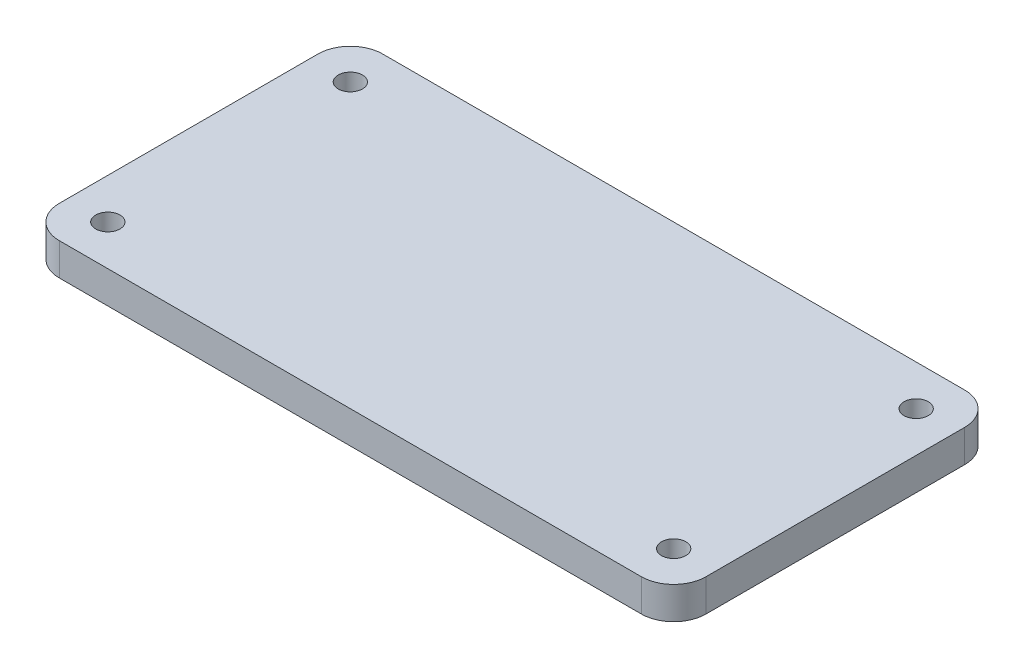
ISO-10303-21;
HEADER;
FILE_DESCRIPTION(('STEP AP214'),'2;1');
FILE_NAME('part.step','',(''),(''),'','','');
FILE_SCHEMA(('AUTOMOTIVE_DESIGN { 1 0 10303 214 1 1 1 1 }'));
ENDSEC;
DATA;
#1=APPLICATION_CONTEXT('core data for automotive mechanical design processes');
#2=APPLICATION_PROTOCOL_DEFINITION('international standard','automotive_design',2000,#1);
#3=PRODUCT_CONTEXT('',#1,'mechanical');
#4=PRODUCT('Part','Part','',(#3));
#5=PRODUCT_RELATED_PRODUCT_CATEGORY('part','',(#4));
#6=PRODUCT_DEFINITION_FORMATION('','',#4);
#7=PRODUCT_DEFINITION_CONTEXT('part definition',#1,'design');
#8=PRODUCT_DEFINITION('design','',#6,#7);
#9=PRODUCT_DEFINITION_SHAPE('','',#8);
#10=(LENGTH_UNIT() NAMED_UNIT(*) SI_UNIT(.MILLI.,.METRE.));
#11=(NAMED_UNIT(*) PLANE_ANGLE_UNIT() SI_UNIT($,.RADIAN.));
#12=(NAMED_UNIT(*) SI_UNIT($,.STERADIAN.) SOLID_ANGLE_UNIT());
#13=UNCERTAINTY_MEASURE_WITH_UNIT(LENGTH_MEASURE(1.E-05),#10,'distance_accuracy_value','');
#14=(GEOMETRIC_REPRESENTATION_CONTEXT(3) GLOBAL_UNCERTAINTY_ASSIGNED_CONTEXT((#13)) GLOBAL_UNIT_ASSIGNED_CONTEXT((#10,
#11,#12)) REPRESENTATION_CONTEXT('',''));
#15=CARTESIAN_POINT('',(0.,0.,0.));
#16=DIRECTION('',(0.,0.,1.));
#17=DIRECTION('',(1.,0.,0.));
#18=AXIS2_PLACEMENT_3D('',#15,#16,#17);
#19=CARTESIAN_POINT('',(0.,4.,0.));
#20=DIRECTION('',(0.,-1.,0.));
#21=DIRECTION('',(0.,0.,-1.));
#22=AXIS2_PLACEMENT_3D('',#19,#20,#21);
#23=PLANE('',#22);
#24=DIRECTION('',(0.,0.,1.));
#25=VECTOR('',#24,1.);
#26=CARTESIAN_POINT('',(-40.,4.,20.));
#27=LINE('',#26,#25);
#28=CARTESIAN_POINT('',(-40.,4.,-16.));
#29=VERTEX_POINT('',#28);
#30=CARTESIAN_POINT('',(-40.,4.,16.));
#31=VERTEX_POINT('',#30);
#32=EDGE_CURVE('E141',#29,#31,#27,.T.);
#33=ORIENTED_EDGE('',*,*,#32,.T.);
#34=CARTESIAN_POINT('',(-36.,4.,16.));
#35=DIRECTION('',(0.,-1.,0.));
#36=DIRECTION('',(0.,0.,-1.));
#37=AXIS2_PLACEMENT_3D('',#34,#35,#36);
#38=CIRCLE('',#37,4.);
#39=CARTESIAN_POINT('',(-36.,4.,20.));
#40=VERTEX_POINT('',#39);
#41=EDGE_CURVE('E156',#31,#40,#38,.F.);
#42=ORIENTED_EDGE('',*,*,#41,.T.);
#43=DIRECTION('',(1.,0.,0.));
#44=VECTOR('',#43,1.);
#45=CARTESIAN_POINT('',(-40.,4.,20.));
#46=LINE('',#45,#44);
#47=CARTESIAN_POINT('',(36.,4.,20.));
#48=VERTEX_POINT('',#47);
#49=EDGE_CURVE('E123',#40,#48,#46,.T.);
#50=ORIENTED_EDGE('',*,*,#49,.T.);
#51=CARTESIAN_POINT('',(36.,4.,16.));
#52=DIRECTION('',(0.,-1.,0.));
#53=DIRECTION('',(0.,0.,-1.));
#54=AXIS2_PLACEMENT_3D('',#51,#52,#53);
#55=CIRCLE('',#54,4.);
#56=CARTESIAN_POINT('',(40.,4.,16.));
#57=VERTEX_POINT('',#56);
#58=EDGE_CURVE('E151',#48,#57,#55,.F.);
#59=ORIENTED_EDGE('',*,*,#58,.T.);
#60=DIRECTION('',(0.,0.,-1.));
#61=VECTOR('',#60,1.);
#62=CARTESIAN_POINT('',(40.,4.,20.));
#63=LINE('',#62,#61);
#64=CARTESIAN_POINT('',(40.,4.,-16.));
#65=VERTEX_POINT('',#64);
#66=EDGE_CURVE('E167',#57,#65,#63,.T.);
#67=ORIENTED_EDGE('',*,*,#66,.T.);
#68=CARTESIAN_POINT('',(36.,4.,-16.));
#69=DIRECTION('',(0.,-1.,0.));
#70=DIRECTION('',(0.,0.,-1.));
#71=AXIS2_PLACEMENT_3D('',#68,#69,#70);
#72=CIRCLE('',#71,4.);
#73=CARTESIAN_POINT('',(36.,4.,-20.));
#74=VERTEX_POINT('',#73);
#75=EDGE_CURVE('E59',#65,#74,#72,.F.);
#76=ORIENTED_EDGE('',*,*,#75,.T.);
#77=DIRECTION('',(-1.,0.,0.));
#78=VECTOR('',#77,1.);
#79=CARTESIAN_POINT('',(-40.,4.,-20.));
#80=LINE('',#79,#78);
#81=CARTESIAN_POINT('',(-36.,4.,-20.));
#82=VERTEX_POINT('',#81);
#83=EDGE_CURVE('E142',#74,#82,#80,.T.);
#84=ORIENTED_EDGE('',*,*,#83,.T.);
#85=CARTESIAN_POINT('',(-36.,4.,-16.));
#86=DIRECTION('',(0.,-1.,0.));
#87=DIRECTION('',(0.,0.,-1.));
#88=AXIS2_PLACEMENT_3D('',#85,#86,#87);
#89=CIRCLE('',#88,4.);
#90=EDGE_CURVE('E154',#82,#29,#89,.F.);
#91=ORIENTED_EDGE('',*,*,#90,.T.);
#92=EDGE_LOOP('',(#33,#42,#50,#59,#67,#76,#84,#91));
#93=FACE_BOUND('',#92,.T.);
#94=CARTESIAN_POINT('',(-35.,4.,-15.));
#95=DIRECTION('',(0.,1.,0.));
#96=DIRECTION('',(0.,0.,1.));
#97=AXIS2_PLACEMENT_3D('',#94,#95,#96);
#98=CIRCLE('',#97,1.5);
#99=CARTESIAN_POINT('',(-35.,4.,-13.5));
#100=VERTEX_POINT('',#99);
#101=EDGE_CURVE('E136',#100,#100,#98,.T.);
#102=ORIENTED_EDGE('',*,*,#101,.F.);
#103=EDGE_LOOP('',(#102));
#104=FACE_BOUND('',#103,.T.);
#105=CARTESIAN_POINT('',(35.,4.,-15.));
#106=DIRECTION('',(0.,1.,0.));
#107=DIRECTION('',(0.,0.,-1.));
#108=AXIS2_PLACEMENT_3D('',#105,#106,#107);
#109=CIRCLE('',#108,1.5);
#110=CARTESIAN_POINT('',(35.,4.,-16.5));
#111=VERTEX_POINT('',#110);
#112=EDGE_CURVE('E184',#111,#111,#109,.T.);
#113=ORIENTED_EDGE('',*,*,#112,.F.);
#114=EDGE_LOOP('',(#113));
#115=FACE_BOUND('',#114,.T.);
#116=CARTESIAN_POINT('',(35.,4.,15.));
#117=DIRECTION('',(0.,1.,0.));
#118=DIRECTION('',(0.,0.,1.));
#119=AXIS2_PLACEMENT_3D('',#116,#117,#118);
#120=CIRCLE('',#119,1.5);
#121=CARTESIAN_POINT('',(35.,4.,16.5));
#122=VERTEX_POINT('',#121);
#123=EDGE_CURVE('E190',#122,#122,#120,.T.);
#124=ORIENTED_EDGE('',*,*,#123,.F.);
#125=EDGE_LOOP('',(#124));
#126=FACE_BOUND('',#125,.T.);
#127=CARTESIAN_POINT('',(-35.,4.,15.));
#128=DIRECTION('',(0.,1.,0.));
#129=DIRECTION('',(0.,0.,-1.));
#130=AXIS2_PLACEMENT_3D('',#127,#128,#129);
#131=CIRCLE('',#130,1.5);
#132=CARTESIAN_POINT('',(-35.,4.,13.5));
#133=VERTEX_POINT('',#132);
#134=EDGE_CURVE('E196',#133,#133,#131,.T.);
#135=ORIENTED_EDGE('',*,*,#134,.F.);
#136=EDGE_LOOP('',(#135));
#137=FACE_BOUND('',#136,.T.);
#138=ADVANCED_FACE('F37',(#93,#104,#115,#126,#137),#23,.F.);
#139=CARTESIAN_POINT('',(0.,0.,0.));
#140=DIRECTION('',(0.,-1.,0.));
#141=DIRECTION('',(0.,0.,-1.));
#142=AXIS2_PLACEMENT_3D('',#139,#140,#141);
#143=PLANE('',#142);
#144=CARTESIAN_POINT('',(35.,0.,15.));
#145=DIRECTION('',(0.,1.,0.));
#146=DIRECTION('',(0.,0.,1.));
#147=AXIS2_PLACEMENT_3D('',#144,#145,#146);
#148=CIRCLE('',#147,1.5);
#149=CARTESIAN_POINT('',(35.,0.,16.5));
#150=VERTEX_POINT('',#149);
#151=EDGE_CURVE('E193',#150,#150,#148,.T.);
#152=ORIENTED_EDGE('',*,*,#151,.T.);
#153=EDGE_LOOP('',(#152));
#154=FACE_BOUND('',#153,.T.);
#155=CARTESIAN_POINT('',(-35.,0.,-15.));
#156=DIRECTION('',(0.,1.,0.));
#157=DIRECTION('',(0.,0.,1.));
#158=AXIS2_PLACEMENT_3D('',#155,#156,#157);
#159=CIRCLE('',#158,1.5);
#160=CARTESIAN_POINT('',(-35.,0.,-13.5));
#161=VERTEX_POINT('',#160);
#162=EDGE_CURVE('E181',#161,#161,#159,.T.);
#163=ORIENTED_EDGE('',*,*,#162,.T.);
#164=EDGE_LOOP('',(#163));
#165=FACE_BOUND('',#164,.T.);
#166=DIRECTION('',(1.,0.,0.));
#167=VECTOR('',#166,1.);
#168=CARTESIAN_POINT('',(-40.,0.,20.));
#169=LINE('',#168,#167);
#170=CARTESIAN_POINT('',(-36.,0.,20.));
#171=VERTEX_POINT('',#170);
#172=CARTESIAN_POINT('',(36.,0.,20.));
#173=VERTEX_POINT('',#172);
#174=EDGE_CURVE('E120',#171,#173,#169,.T.);
#175=ORIENTED_EDGE('',*,*,#174,.F.);
#176=CARTESIAN_POINT('',(-36.,0.,16.));
#177=DIRECTION('',(0.,-1.,0.));
#178=DIRECTION('',(0.,0.,-1.));
#179=AXIS2_PLACEMENT_3D('',#176,#177,#178);
#180=CIRCLE('',#179,4.);
#181=CARTESIAN_POINT('',(-40.,0.,16.));
#182=VERTEX_POINT('',#181);
#183=EDGE_CURVE('E103',#171,#182,#180,.T.);
#184=ORIENTED_EDGE('',*,*,#183,.T.);
#185=DIRECTION('',(0.,0.,1.));
#186=VECTOR('',#185,1.);
#187=CARTESIAN_POINT('',(-40.,0.,20.));
#188=LINE('',#187,#186);
#189=CARTESIAN_POINT('',(-40.,0.,-16.));
#190=VERTEX_POINT('',#189);
#191=EDGE_CURVE('E131',#190,#182,#188,.T.);
#192=ORIENTED_EDGE('',*,*,#191,.F.);
#193=CARTESIAN_POINT('',(-36.,0.,-16.));
#194=DIRECTION('',(0.,-1.,0.));
#195=DIRECTION('',(0.,0.,-1.));
#196=AXIS2_PLACEMENT_3D('',#193,#194,#195);
#197=CIRCLE('',#196,4.);
#198=CARTESIAN_POINT('',(-36.,0.,-20.));
#199=VERTEX_POINT('',#198);
#200=EDGE_CURVE('E114',#190,#199,#197,.T.);
#201=ORIENTED_EDGE('',*,*,#200,.T.);
#202=DIRECTION('',(-1.,0.,0.));
#203=VECTOR('',#202,1.);
#204=CARTESIAN_POINT('',(-40.,0.,-20.));
#205=LINE('',#204,#203);
#206=CARTESIAN_POINT('',(36.,0.,-20.));
#207=VERTEX_POINT('',#206);
#208=EDGE_CURVE('E134',#207,#199,#205,.T.);
#209=ORIENTED_EDGE('',*,*,#208,.F.);
#210=CARTESIAN_POINT('',(36.,0.,-16.));
#211=DIRECTION('',(0.,-1.,0.));
#212=DIRECTION('',(0.,0.,-1.));
#213=AXIS2_PLACEMENT_3D('',#210,#211,#212);
#214=CIRCLE('',#213,4.);
#215=CARTESIAN_POINT('',(40.,0.,-16.));
#216=VERTEX_POINT('',#215);
#217=EDGE_CURVE('E145',#207,#216,#214,.T.);
#218=ORIENTED_EDGE('',*,*,#217,.T.);
#219=DIRECTION('',(0.,0.,-1.));
#220=VECTOR('',#219,1.);
#221=CARTESIAN_POINT('',(40.,0.,20.));
#222=LINE('',#221,#220);
#223=CARTESIAN_POINT('',(40.,0.,16.));
#224=VERTEX_POINT('',#223);
#225=EDGE_CURVE('E130',#224,#216,#222,.T.);
#226=ORIENTED_EDGE('',*,*,#225,.F.);
#227=CARTESIAN_POINT('',(36.,0.,16.));
#228=DIRECTION('',(0.,-1.,0.));
#229=DIRECTION('',(0.,0.,-1.));
#230=AXIS2_PLACEMENT_3D('',#227,#228,#229);
#231=CIRCLE('',#230,4.);
#232=EDGE_CURVE('E124',#224,#173,#231,.T.);
#233=ORIENTED_EDGE('',*,*,#232,.T.);
#234=EDGE_LOOP('',(#175,#184,#192,#201,#209,#218,#226,#233));
#235=FACE_BOUND('',#234,.T.);
#236=CARTESIAN_POINT('',(35.,0.,-15.));
#237=DIRECTION('',(0.,1.,0.));
#238=DIRECTION('',(0.,0.,-1.));
#239=AXIS2_PLACEMENT_3D('',#236,#237,#238);
#240=CIRCLE('',#239,1.5);
#241=CARTESIAN_POINT('',(35.,0.,-16.5));
#242=VERTEX_POINT('',#241);
#243=EDGE_CURVE('E187',#242,#242,#240,.T.);
#244=ORIENTED_EDGE('',*,*,#243,.T.);
#245=EDGE_LOOP('',(#244));
#246=FACE_BOUND('',#245,.T.);
#247=CARTESIAN_POINT('',(-35.,0.,15.));
#248=DIRECTION('',(0.,1.,0.));
#249=DIRECTION('',(0.,0.,-1.));
#250=AXIS2_PLACEMENT_3D('',#247,#248,#249);
#251=CIRCLE('',#250,1.5);
#252=CARTESIAN_POINT('',(-35.,0.,13.5));
#253=VERTEX_POINT('',#252);
#254=EDGE_CURVE('E199',#253,#253,#251,.T.);
#255=ORIENTED_EDGE('',*,*,#254,.T.);
#256=EDGE_LOOP('',(#255));
#257=FACE_BOUND('',#256,.T.);
#258=ADVANCED_FACE('F127',(#154,#165,#235,#246,#257),#143,.T.);
#259=CARTESIAN_POINT('',(-40.,4.,20.));
#260=DIRECTION('',(1.,0.,0.));
#261=DIRECTION('',(0.,0.,-1.));
#262=AXIS2_PLACEMENT_3D('',#259,#260,#261);
#263=PLANE('',#262);
#264=ORIENTED_EDGE('',*,*,#191,.T.);
#265=DIRECTION('',(0.,-1.,0.));
#266=VECTOR('',#265,1.);
#267=CARTESIAN_POINT('',(-40.,4.,16.));
#268=LINE('',#267,#266);
#269=EDGE_CURVE('E108',#182,#31,#268,.F.);
#270=ORIENTED_EDGE('',*,*,#269,.T.);
#271=ORIENTED_EDGE('',*,*,#32,.F.);
#272=DIRECTION('',(0.,-1.,0.));
#273=VECTOR('',#272,1.);
#274=CARTESIAN_POINT('',(-40.,4.,-16.));
#275=LINE('',#274,#273);
#276=EDGE_CURVE('E113',#29,#190,#275,.T.);
#277=ORIENTED_EDGE('',*,*,#276,.T.);
#278=EDGE_LOOP('',(#264,#270,#271,#277));
#279=FACE_BOUND('',#278,.T.);
#280=ADVANCED_FACE('F213',(#279),#263,.F.);
#281=CARTESIAN_POINT('',(-40.,4.,20.));
#282=DIRECTION('',(0.,0.,-1.));
#283=DIRECTION('',(-1.,0.,0.));
#284=AXIS2_PLACEMENT_3D('',#281,#282,#283);
#285=PLANE('',#284);
#286=ORIENTED_EDGE('',*,*,#49,.F.);
#287=DIRECTION('',(0.,-1.,0.));
#288=VECTOR('',#287,1.);
#289=CARTESIAN_POINT('',(-36.,4.,20.));
#290=LINE('',#289,#288);
#291=EDGE_CURVE('E107',#40,#171,#290,.T.);
#292=ORIENTED_EDGE('',*,*,#291,.T.);
#293=ORIENTED_EDGE('',*,*,#174,.T.);
#294=DIRECTION('',(0.,-1.,0.));
#295=VECTOR('',#294,1.);
#296=CARTESIAN_POINT('',(36.,4.,20.));
#297=LINE('',#296,#295);
#298=EDGE_CURVE('E125',#173,#48,#297,.F.);
#299=ORIENTED_EDGE('',*,*,#298,.T.);
#300=EDGE_LOOP('',(#286,#292,#293,#299));
#301=FACE_BOUND('',#300,.T.);
#302=ADVANCED_FACE('F119',(#301),#285,.F.);
#303=CARTESIAN_POINT('',(40.,4.,20.));
#304=DIRECTION('',(-1.,0.,0.));
#305=DIRECTION('',(0.,0.,1.));
#306=AXIS2_PLACEMENT_3D('',#303,#304,#305);
#307=PLANE('',#306);
#308=ORIENTED_EDGE('',*,*,#225,.T.);
#309=DIRECTION('',(0.,-1.,0.));
#310=VECTOR('',#309,1.);
#311=CARTESIAN_POINT('',(40.,4.,-16.));
#312=LINE('',#311,#310);
#313=EDGE_CURVE('E11',#216,#65,#312,.F.);
#314=ORIENTED_EDGE('',*,*,#313,.T.);
#315=ORIENTED_EDGE('',*,*,#66,.F.);
#316=DIRECTION('',(0.,-1.,0.));
#317=VECTOR('',#316,1.);
#318=CARTESIAN_POINT('',(40.,4.,16.));
#319=LINE('',#318,#317);
#320=EDGE_CURVE('E45',#57,#224,#319,.T.);
#321=ORIENTED_EDGE('',*,*,#320,.T.);
#322=EDGE_LOOP('',(#308,#314,#315,#321));
#323=FACE_BOUND('',#322,.T.);
#324=ADVANCED_FACE('F165',(#323),#307,.F.);
#325=CARTESIAN_POINT('',(-40.,4.,-20.));
#326=DIRECTION('',(0.,0.,1.));
#327=DIRECTION('',(1.,0.,0.));
#328=AXIS2_PLACEMENT_3D('',#325,#326,#327);
#329=PLANE('',#328);
#330=ORIENTED_EDGE('',*,*,#208,.T.);
#331=DIRECTION('',(0.,-1.,0.));
#332=VECTOR('',#331,1.);
#333=CARTESIAN_POINT('',(-36.,4.,-20.));
#334=LINE('',#333,#332);
#335=EDGE_CURVE('E52',#199,#82,#334,.F.);
#336=ORIENTED_EDGE('',*,*,#335,.T.);
#337=ORIENTED_EDGE('',*,*,#83,.F.);
#338=DIRECTION('',(0.,-1.,0.));
#339=VECTOR('',#338,1.);
#340=CARTESIAN_POINT('',(36.,4.,-20.));
#341=LINE('',#340,#339);
#342=EDGE_CURVE('E158',#74,#207,#341,.T.);
#343=ORIENTED_EDGE('',*,*,#342,.T.);
#344=EDGE_LOOP('',(#330,#336,#337,#343));
#345=FACE_BOUND('',#344,.T.);
#346=ADVANCED_FACE('F174',(#345),#329,.F.);
#347=CARTESIAN_POINT('',(-35.,4.,-15.));
#348=DIRECTION('',(0.,-1.,0.));
#349=DIRECTION('',(0.,0.,-1.));
#350=AXIS2_PLACEMENT_3D('',#347,#348,#349);
#351=CYLINDRICAL_SURFACE('',#350,1.5);
#352=ORIENTED_EDGE('',*,*,#101,.T.);
#353=EDGE_LOOP('',(#352));
#354=FACE_BOUND('',#353,.T.);
#355=ORIENTED_EDGE('',*,*,#162,.F.);
#356=EDGE_LOOP('',(#355));
#357=FACE_BOUND('',#356,.T.);
#358=ADVANCED_FACE('F218',(#354,#357),#351,.F.);
#359=CARTESIAN_POINT('',(35.,4.,-15.));
#360=DIRECTION('',(0.,-1.,0.));
#361=DIRECTION('',(0.,0.,-1.));
#362=AXIS2_PLACEMENT_3D('',#359,#360,#361);
#363=CYLINDRICAL_SURFACE('',#362,1.5);
#364=ORIENTED_EDGE('',*,*,#112,.T.);
#365=EDGE_LOOP('',(#364));
#366=FACE_BOUND('',#365,.T.);
#367=ORIENTED_EDGE('',*,*,#243,.F.);
#368=EDGE_LOOP('',(#367));
#369=FACE_BOUND('',#368,.T.);
#370=ADVANCED_FACE('F313',(#366,#369),#363,.F.);
#371=CARTESIAN_POINT('',(35.,4.,15.));
#372=DIRECTION('',(0.,-1.,0.));
#373=DIRECTION('',(0.,0.,-1.));
#374=AXIS2_PLACEMENT_3D('',#371,#372,#373);
#375=CYLINDRICAL_SURFACE('',#374,1.5);
#376=ORIENTED_EDGE('',*,*,#123,.T.);
#377=EDGE_LOOP('',(#376));
#378=FACE_BOUND('',#377,.T.);
#379=ORIENTED_EDGE('',*,*,#151,.F.);
#380=EDGE_LOOP('',(#379));
#381=FACE_BOUND('',#380,.T.);
#382=ADVANCED_FACE('F304',(#378,#381),#375,.F.);
#383=CARTESIAN_POINT('',(-35.,4.,15.));
#384=DIRECTION('',(0.,-1.,0.));
#385=DIRECTION('',(0.,0.,-1.));
#386=AXIS2_PLACEMENT_3D('',#383,#384,#385);
#387=CYLINDRICAL_SURFACE('',#386,1.5);
#388=ORIENTED_EDGE('',*,*,#134,.T.);
#389=EDGE_LOOP('',(#388));
#390=FACE_BOUND('',#389,.T.);
#391=ORIENTED_EDGE('',*,*,#254,.F.);
#392=EDGE_LOOP('',(#391));
#393=FACE_BOUND('',#392,.T.);
#394=ADVANCED_FACE('F205',(#390,#393),#387,.F.);
#395=CARTESIAN_POINT('',(-36.,4.,16.));
#396=DIRECTION('',(0.,-1.,0.));
#397=DIRECTION('',(0.,0.,-1.));
#398=AXIS2_PLACEMENT_3D('',#395,#396,#397);
#399=CYLINDRICAL_SURFACE('',#398,4.);
#400=ORIENTED_EDGE('',*,*,#41,.F.);
#401=ORIENTED_EDGE('',*,*,#269,.F.);
#402=ORIENTED_EDGE('',*,*,#183,.F.);
#403=ORIENTED_EDGE('',*,*,#291,.F.);
#404=EDGE_LOOP('',(#400,#401,#402,#403));
#405=FACE_BOUND('',#404,.T.);
#406=ADVANCED_FACE('F106',(#405),#399,.T.);
#407=CARTESIAN_POINT('',(-36.,4.,-16.));
#408=DIRECTION('',(0.,-1.,0.));
#409=DIRECTION('',(0.,0.,-1.));
#410=AXIS2_PLACEMENT_3D('',#407,#408,#409);
#411=CYLINDRICAL_SURFACE('',#410,4.);
#412=ORIENTED_EDGE('',*,*,#90,.F.);
#413=ORIENTED_EDGE('',*,*,#335,.F.);
#414=ORIENTED_EDGE('',*,*,#200,.F.);
#415=ORIENTED_EDGE('',*,*,#276,.F.);
#416=EDGE_LOOP('',(#412,#413,#414,#415));
#417=FACE_BOUND('',#416,.T.);
#418=ADVANCED_FACE('F232',(#417),#411,.T.);
#419=CARTESIAN_POINT('',(36.,4.,-16.));
#420=DIRECTION('',(0.,-1.,0.));
#421=DIRECTION('',(0.,0.,-1.));
#422=AXIS2_PLACEMENT_3D('',#419,#420,#421);
#423=CYLINDRICAL_SURFACE('',#422,4.);
#424=ORIENTED_EDGE('',*,*,#75,.F.);
#425=ORIENTED_EDGE('',*,*,#313,.F.);
#426=ORIENTED_EDGE('',*,*,#217,.F.);
#427=ORIENTED_EDGE('',*,*,#342,.F.);
#428=EDGE_LOOP('',(#424,#425,#426,#427));
#429=FACE_BOUND('',#428,.T.);
#430=ADVANCED_FACE('F173',(#429),#423,.T.);
#431=CARTESIAN_POINT('',(36.,4.,16.));
#432=DIRECTION('',(0.,-1.,0.));
#433=DIRECTION('',(0.,0.,-1.));
#434=AXIS2_PLACEMENT_3D('',#431,#432,#433);
#435=CYLINDRICAL_SURFACE('',#434,4.);
#436=ORIENTED_EDGE('',*,*,#58,.F.);
#437=ORIENTED_EDGE('',*,*,#298,.F.);
#438=ORIENTED_EDGE('',*,*,#232,.F.);
#439=ORIENTED_EDGE('',*,*,#320,.F.);
#440=EDGE_LOOP('',(#436,#437,#438,#439));
#441=FACE_BOUND('',#440,.T.);
#442=ADVANCED_FACE('F39',(#441),#435,.T.);
#443=CLOSED_SHELL('',(#138,#258,#280,#302,#324,#346,#358,#370,#382,#394,#406,#418,#430,#442));
#444=MANIFOLD_SOLID_BREP('B2',#443);
#445=ADVANCED_BREP_SHAPE_REPRESENTATION('',(#18,#444),#14);
#446=SHAPE_DEFINITION_REPRESENTATION(#9,#445);
ENDSEC;
END-ISO-10303-21;
